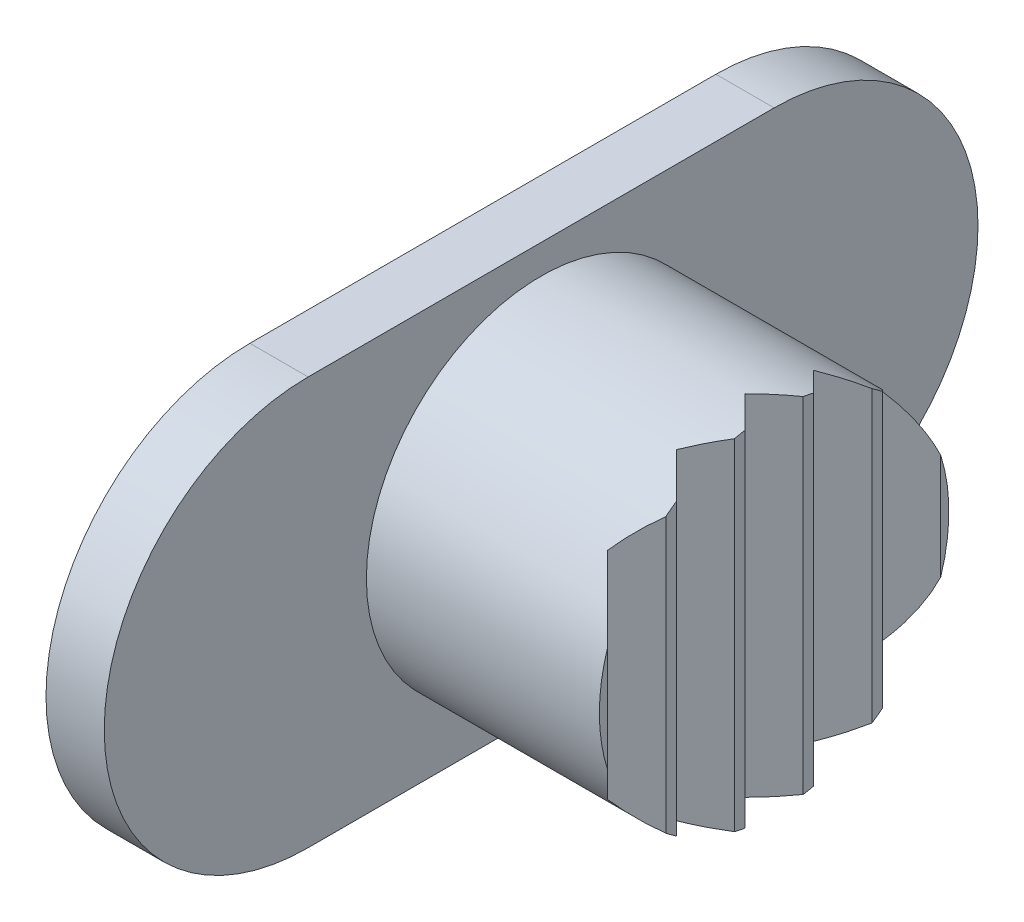
ISO-10303-21;
HEADER;
FILE_DESCRIPTION(('STEP AP214'),'2;1');
FILE_NAME('part.step','',(''),(''),'','','');
FILE_SCHEMA(('AUTOMOTIVE_DESIGN { 1 0 10303 214 1 1 1 1 }'));
ENDSEC;
DATA;
#1=APPLICATION_CONTEXT('core data for automotive mechanical design processes');
#2=APPLICATION_PROTOCOL_DEFINITION('international standard','automotive_design',2000,#1);
#3=PRODUCT_CONTEXT('',#1,'mechanical');
#4=PRODUCT('Part','Part','',(#3));
#5=PRODUCT_RELATED_PRODUCT_CATEGORY('part','',(#4));
#6=PRODUCT_DEFINITION_FORMATION('','',#4);
#7=PRODUCT_DEFINITION_CONTEXT('part definition',#1,'design');
#8=PRODUCT_DEFINITION('design','',#6,#7);
#9=PRODUCT_DEFINITION_SHAPE('','',#8);
#10=(LENGTH_UNIT() NAMED_UNIT(*) SI_UNIT(.MILLI.,.METRE.));
#11=(NAMED_UNIT(*) PLANE_ANGLE_UNIT() SI_UNIT($,.RADIAN.));
#12=(NAMED_UNIT(*) SI_UNIT($,.STERADIAN.) SOLID_ANGLE_UNIT());
#13=UNCERTAINTY_MEASURE_WITH_UNIT(LENGTH_MEASURE(1.E-05),#10,'distance_accuracy_value','');
#14=(GEOMETRIC_REPRESENTATION_CONTEXT(3) GLOBAL_UNCERTAINTY_ASSIGNED_CONTEXT((#13)) GLOBAL_UNIT_ASSIGNED_CONTEXT((#10,
#11,#12)) REPRESENTATION_CONTEXT('',''));
#15=CARTESIAN_POINT('',(0.,0.,0.));
#16=DIRECTION('',(0.,0.,1.));
#17=DIRECTION('',(1.,0.,0.));
#18=AXIS2_PLACEMENT_3D('',#15,#16,#17);
#19=CARTESIAN_POINT('',(5.,0.,0.));
#20=DIRECTION('',(1.,0.,0.));
#21=DIRECTION('',(0.,0.,-1.));
#22=AXIS2_PLACEMENT_3D('',#19,#20,#21);
#23=PLANE('',#22);
#24=DIRECTION('',(0.,-1.,0.));
#25=VECTOR('',#24,1.);
#26=CARTESIAN_POINT('',(5.,0.,-1.86));
#27=LINE('',#26,#25);
#28=CARTESIAN_POINT('',(4.99999999999997,2.35380542951197,-1.86000000000003));
#29=VERTEX_POINT('',#28);
#30=CARTESIAN_POINT('',(4.99999999999997,-2.35380542951197,-1.86000000000003));
#31=VERTEX_POINT('',#30);
#32=EDGE_CURVE('E11',#29,#31,#27,.T.);
#33=ORIENTED_EDGE('',*,*,#32,.F.);
#34=CARTESIAN_POINT('',(5.,0.,0.));
#35=DIRECTION('',(1.,0.,0.));
#36=DIRECTION('',(0.,0.,-1.));
#37=AXIS2_PLACEMENT_3D('',#34,#35,#36);
#38=CIRCLE('',#37,3.);
#39=CARTESIAN_POINT('',(4.99999999999995,2.48547782126492,-1.68000000000001));
#40=VERTEX_POINT('',#39);
#41=EDGE_CURVE('E276',#29,#40,#38,.T.);
#42=ORIENTED_EDGE('',*,*,#41,.T.);
#43=DIRECTION('',(0.,1.,0.));
#44=VECTOR('',#43,1.);
#45=CARTESIAN_POINT('',(5.,0.,-1.68000000000006));
#46=LINE('',#45,#44);
#47=CARTESIAN_POINT('',(5.,-2.48547782126492,-1.68000000000006));
#48=VERTEX_POINT('',#47);
#49=EDGE_CURVE('E386',#48,#40,#46,.T.);
#50=ORIENTED_EDGE('',*,*,#49,.F.);
#51=EDGE_CURVE('E275',#48,#31,#38,.T.);
#52=ORIENTED_EDGE('',*,*,#51,.T.);
#53=EDGE_LOOP('',(#33,#42,#50,#52));
#54=FACE_BOUND('',#53,.T.);
#55=ADVANCED_FACE('F39',(#54),#23,.T.);
#56=DIRECTION('',(0.,-1.,0.));
#57=VECTOR('',#56,1.);
#58=CARTESIAN_POINT('',(5.,0.,-0.680000000000011));
#59=LINE('',#58,#57);
#60=CARTESIAN_POINT('',(4.99999999999998,2.92191717883994,-0.680000000000027));
#61=VERTEX_POINT('',#60);
#62=CARTESIAN_POINT('',(4.99999999999998,-2.92191717883995,-0.680000000000027));
#63=VERTEX_POINT('',#62);
#64=EDGE_CURVE('E389',#61,#63,#59,.T.);
#65=ORIENTED_EDGE('',*,*,#64,.F.);
#66=CARTESIAN_POINT('',(4.99999999999999,2.9580398915498,-0.500000000000027));
#67=VERTEX_POINT('',#66);
#68=EDGE_CURVE('E473',#61,#67,#38,.T.);
#69=ORIENTED_EDGE('',*,*,#68,.T.);
#70=DIRECTION('',(0.,1.,0.));
#71=VECTOR('',#70,1.);
#72=CARTESIAN_POINT('',(5.,0.,-0.500000000000042));
#73=LINE('',#72,#71);
#74=CARTESIAN_POINT('',(5.,-2.9580398915498,-0.500000000000042));
#75=VERTEX_POINT('',#74);
#76=EDGE_CURVE('E380',#75,#67,#73,.T.);
#77=ORIENTED_EDGE('',*,*,#76,.F.);
#78=EDGE_CURVE('E436',#75,#63,#38,.T.);
#79=ORIENTED_EDGE('',*,*,#78,.T.);
#80=EDGE_LOOP('',(#65,#69,#77,#79));
#81=FACE_BOUND('',#80,.T.);
#82=ADVANCED_FACE('F412',(#81),#23,.T.);
#83=DIRECTION('',(0.,-1.,0.));
#84=VECTOR('',#83,1.);
#85=CARTESIAN_POINT('',(5.,0.,0.499999999999988));
#86=LINE('',#85,#84);
#87=CARTESIAN_POINT('',(4.99999999999995,2.95803989154981,0.499999999999942));
#88=VERTEX_POINT('',#87);
#89=CARTESIAN_POINT('',(4.99999999999995,-2.95803989154981,0.499999999999942));
#90=VERTEX_POINT('',#89);
#91=EDGE_CURVE('E383',#88,#90,#86,.T.);
#92=ORIENTED_EDGE('',*,*,#91,.F.);
#93=CARTESIAN_POINT('',(4.99999999999998,2.92191717883995,0.679999999999994));
#94=VERTEX_POINT('',#93);
#95=EDGE_CURVE('E431',#88,#94,#38,.T.);
#96=ORIENTED_EDGE('',*,*,#95,.T.);
#97=DIRECTION('',(0.,1.,0.));
#98=VECTOR('',#97,1.);
#99=CARTESIAN_POINT('',(5.,0.,0.67999999999997));
#100=LINE('',#99,#98);
#101=CARTESIAN_POINT('',(5.,-2.92191717883996,0.67999999999997));
#102=VERTEX_POINT('',#101);
#103=EDGE_CURVE('E374',#102,#94,#100,.T.);
#104=ORIENTED_EDGE('',*,*,#103,.F.);
#105=EDGE_CURVE('E432',#102,#90,#38,.T.);
#106=ORIENTED_EDGE('',*,*,#105,.T.);
#107=EDGE_LOOP('',(#92,#96,#104,#106));
#108=FACE_BOUND('',#107,.T.);
#109=ADVANCED_FACE('F423',(#108),#23,.T.);
#110=DIRECTION('',(0.,-1.,0.));
#111=VECTOR('',#110,1.);
#112=CARTESIAN_POINT('',(5.,0.,1.68000000000001));
#113=LINE('',#112,#111);
#114=CARTESIAN_POINT('',(4.99999999999999,2.48547782126495,1.67999999999999));
#115=VERTEX_POINT('',#114);
#116=CARTESIAN_POINT('',(4.99999999999999,-2.48547782126495,1.67999999999999));
#117=VERTEX_POINT('',#116);
#118=EDGE_CURVE('E377',#115,#117,#113,.T.);
#119=ORIENTED_EDGE('',*,*,#118,.F.);
#120=CARTESIAN_POINT('',(4.99999999999999,2.35380542951198,1.85999999999999));
#121=VERTEX_POINT('',#120);
#122=EDGE_CURVE('E427',#115,#121,#38,.T.);
#123=ORIENTED_EDGE('',*,*,#122,.T.);
#124=DIRECTION('',(0.,1.,0.));
#125=VECTOR('',#124,1.);
#126=CARTESIAN_POINT('',(5.,0.,1.85999999999998));
#127=LINE('',#126,#125);
#128=CARTESIAN_POINT('',(5.,-2.35380542951198,1.85999999999998));
#129=VERTEX_POINT('',#128);
#130=EDGE_CURVE('E326',#129,#121,#127,.T.);
#131=ORIENTED_EDGE('',*,*,#130,.F.);
#132=EDGE_CURVE('E224',#129,#117,#38,.T.);
#133=ORIENTED_EDGE('',*,*,#132,.T.);
#134=EDGE_LOOP('',(#119,#123,#131,#133));
#135=FACE_BOUND('',#134,.T.);
#136=ADVANCED_FACE('F415',(#135),#23,.T.);
#137=DIRECTION('',(0.,-1.,0.));
#138=VECTOR('',#137,1.);
#139=CARTESIAN_POINT('',(5.,0.,2.86));
#140=LINE('',#139,#138);
#141=CARTESIAN_POINT('',(5.,0.905759349937949,2.86));
#142=VERTEX_POINT('',#141);
#143=CARTESIAN_POINT('',(5.,-0.905759349937951,2.86));
#144=VERTEX_POINT('',#143);
#145=EDGE_CURVE('E202',#142,#144,#140,.T.);
#146=ORIENTED_EDGE('',*,*,#145,.F.);
#147=EDGE_CURVE('E425',#142,#144,#38,.T.);
#148=ORIENTED_EDGE('',*,*,#147,.T.);
#149=EDGE_LOOP('',(#146,#148));
#150=FACE_BOUND('',#149,.T.);
#151=ADVANCED_FACE('F401',(#150),#23,.T.);
#152=CARTESIAN_POINT('',(4.,0.,0.));
#153=DIRECTION('',(-1.,0.,0.));
#154=DIRECTION('',(0.,0.,1.));
#155=AXIS2_PLACEMENT_3D('',#152,#153,#154);
#156=CYLINDRICAL_SURFACE('',#155,3.);
#157=CARTESIAN_POINT('',(1.,0.,0.));
#158=DIRECTION('',(-1.,0.,0.));
#159=DIRECTION('',(0.,0.,1.));
#160=AXIS2_PLACEMENT_3D('',#157,#158,#159);
#161=CIRCLE('',#160,3.);
#162=CARTESIAN_POINT('',(1.,0.,3.));
#163=VERTEX_POINT('',#162);
#164=EDGE_CURVE('E322',#163,#163,#161,.T.);
#165=ORIENTED_EDGE('',*,*,#164,.F.);
#166=EDGE_LOOP('',(#165));
#167=FACE_BOUND('',#166,.T.);
#168=ORIENTED_EDGE('',*,*,#41,.F.);
#169=CARTESIAN_POINT('',(6.86000000000003,0.,0.));
#170=DIRECTION('',(-0.707106781186541,0.,0.707106781186554));
#171=DIRECTION('',(-0.707106781186554,0.,-0.707106781186541));
#172=AXIS2_PLACEMENT_3D('',#169,#170,#171);
#173=ELLIPSE('',#172,4.24264068711933,3.);
#174=CARTESIAN_POINT('',(4.49999999999997,1.85213390444641,-2.36000000000002));
#175=VERTEX_POINT('',#174);
#176=EDGE_CURVE('E266',#29,#175,#173,.T.);
#177=ORIENTED_EDGE('',*,*,#176,.T.);
#178=CARTESIAN_POINT('',(2.14,0.,0.));
#179=DIRECTION('',(-0.707106781186555,0.,-0.70710678118654));
#180=DIRECTION('',(-0.70710678118654,0.,0.707106781186555));
#181=AXIS2_PLACEMENT_3D('',#178,#179,#180);
#182=ELLIPSE('',#181,4.24264068711924,3.);
#183=CARTESIAN_POINT('',(4.99999999999996,0.905759349937729,-2.86000000000003));
#184=VERTEX_POINT('',#183);
#185=EDGE_CURVE('E265',#175,#184,#182,.T.);
#186=ORIENTED_EDGE('',*,*,#185,.T.);
#187=CARTESIAN_POINT('',(5.,-0.90575934993773,-2.86000000000007));
#188=VERTEX_POINT('',#187);
#189=EDGE_CURVE('E271',#188,#184,#38,.T.);
#190=ORIENTED_EDGE('',*,*,#189,.F.);
#191=CARTESIAN_POINT('',(4.49999999999997,-1.85213390444641,-2.36000000000002));
#192=VERTEX_POINT('',#191);
#193=EDGE_CURVE('E55',#188,#192,#182,.T.);
#194=ORIENTED_EDGE('',*,*,#193,.T.);
#195=EDGE_CURVE('E270',#192,#31,#173,.T.);
#196=ORIENTED_EDGE('',*,*,#195,.T.);
#197=ORIENTED_EDGE('',*,*,#51,.F.);
#198=CARTESIAN_POINT('',(3.31999999999998,0.,0.));
#199=DIRECTION('',(-0.707106781186555,0.,-0.70710678118654));
#200=DIRECTION('',(-0.70710678118654,0.,0.707106781186555));
#201=AXIS2_PLACEMENT_3D('',#198,#199,#200);
#202=ELLIPSE('',#201,4.24264068711924,3.);
#203=CARTESIAN_POINT('',(4.49999999999996,-2.75818781086423,-1.18));
#204=VERTEX_POINT('',#203);
#205=EDGE_CURVE('E63',#48,#204,#202,.T.);
#206=ORIENTED_EDGE('',*,*,#205,.T.);
#207=CARTESIAN_POINT('',(5.68000000000008,0.,0.));
#208=DIRECTION('',(-0.707106781186509,0.,0.707106781186585));
#209=DIRECTION('',(-0.707106781186586,0.,-0.70710678118651));
#210=AXIS2_PLACEMENT_3D('',#207,#208,#209);
#211=ELLIPSE('',#210,4.24264068711951,3.);
#212=EDGE_CURVE('E262',#204,#63,#211,.T.);
#213=ORIENTED_EDGE('',*,*,#212,.T.);
#214=ORIENTED_EDGE('',*,*,#78,.F.);
#215=CARTESIAN_POINT('',(4.49999999999999,0.,0.));
#216=DIRECTION('',(-0.70710678118657,0.,-0.707106781186525));
#217=DIRECTION('',(-0.707106781186525,0.,0.70710678118657));
#218=AXIS2_PLACEMENT_3D('',#215,#216,#217);
#219=ELLIPSE('',#218,4.24264068711915,3.);
#220=CARTESIAN_POINT('',(4.49999999999999,-3.,0.));
#221=VERTEX_POINT('',#220);
#222=EDGE_CURVE('E245',#75,#221,#219,.T.);
#223=ORIENTED_EDGE('',*,*,#222,.T.);
#224=CARTESIAN_POINT('',(4.49999999999999,0.,0.));
#225=DIRECTION('',(-0.707106781186532,0.,0.707106781186563));
#226=DIRECTION('',(-0.707106781186563,0.,-0.707106781186532));
#227=AXIS2_PLACEMENT_3D('',#224,#225,#226);
#228=ELLIPSE('',#227,4.24264068711938,3.);
#229=EDGE_CURVE('E254',#221,#90,#228,.T.);
#230=ORIENTED_EDGE('',*,*,#229,.T.);
#231=ORIENTED_EDGE('',*,*,#105,.F.);
#232=CARTESIAN_POINT('',(5.67999999999996,0.,0.));
#233=DIRECTION('',(-0.707106781186555,0.,-0.70710678118654));
#234=DIRECTION('',(-0.70710678118654,0.,0.707106781186555));
#235=AXIS2_PLACEMENT_3D('',#232,#233,#234);
#236=ELLIPSE('',#235,4.24264068711924,3.);
#237=CARTESIAN_POINT('',(4.49999999999998,-2.75818781086423,1.18));
#238=VERTEX_POINT('',#237);
#239=EDGE_CURVE('E208',#102,#238,#236,.T.);
#240=ORIENTED_EDGE('',*,*,#239,.T.);
#241=CARTESIAN_POINT('',(3.31999999999996,0.,0.));
#242=DIRECTION('',(-0.707106781186541,0.,0.707106781186554));
#243=DIRECTION('',(-0.707106781186554,0.,-0.707106781186541));
#244=AXIS2_PLACEMENT_3D('',#241,#242,#243);
#245=ELLIPSE('',#244,4.24264068711933,3.);
#246=EDGE_CURVE('E244',#238,#117,#245,.T.);
#247=ORIENTED_EDGE('',*,*,#246,.T.);
#248=ORIENTED_EDGE('',*,*,#132,.F.);
#249=CARTESIAN_POINT('',(6.85999999999994,0.,0.));
#250=DIRECTION('',(-0.707106781186555,0.,-0.70710678118654));
#251=DIRECTION('',(-0.70710678118654,0.,0.707106781186555));
#252=AXIS2_PLACEMENT_3D('',#249,#250,#251);
#253=ELLIPSE('',#252,4.24264068711924,3.);
#254=CARTESIAN_POINT('',(4.49999999999999,-1.85213390444644,2.36));
#255=VERTEX_POINT('',#254);
#256=EDGE_CURVE('E213',#129,#255,#253,.T.);
#257=ORIENTED_EDGE('',*,*,#256,.T.);
#258=CARTESIAN_POINT('',(2.13999999999995,0.,0.));
#259=DIRECTION('',(-0.707106781186541,0.,0.707106781186554));
#260=DIRECTION('',(-0.707106781186554,0.,-0.707106781186541));
#261=AXIS2_PLACEMENT_3D('',#258,#259,#260);
#262=ELLIPSE('',#261,4.24264068711933,3.);
#263=EDGE_CURVE('E196',#255,#144,#262,.T.);
#264=ORIENTED_EDGE('',*,*,#263,.T.);
#265=ORIENTED_EDGE('',*,*,#147,.F.);
#266=CARTESIAN_POINT('',(4.49999999999999,1.85213390444644,2.36));
#267=VERTEX_POINT('',#266);
#268=EDGE_CURVE('E209',#142,#267,#262,.T.);
#269=ORIENTED_EDGE('',*,*,#268,.T.);
#270=EDGE_CURVE('E216',#267,#121,#253,.T.);
#271=ORIENTED_EDGE('',*,*,#270,.T.);
#272=ORIENTED_EDGE('',*,*,#122,.F.);
#273=CARTESIAN_POINT('',(4.49999999999998,2.75818781086423,1.18));
#274=VERTEX_POINT('',#273);
#275=EDGE_CURVE('E240',#115,#274,#245,.T.);
#276=ORIENTED_EDGE('',*,*,#275,.T.);
#277=EDGE_CURVE('E239',#274,#94,#236,.T.);
#278=ORIENTED_EDGE('',*,*,#277,.T.);
#279=ORIENTED_EDGE('',*,*,#95,.F.);
#280=CARTESIAN_POINT('',(4.49999999999999,3.,0.));
#281=VERTEX_POINT('',#280);
#282=EDGE_CURVE('E250',#88,#281,#228,.T.);
#283=ORIENTED_EDGE('',*,*,#282,.T.);
#284=EDGE_CURVE('E249',#281,#67,#219,.T.);
#285=ORIENTED_EDGE('',*,*,#284,.T.);
#286=ORIENTED_EDGE('',*,*,#68,.F.);
#287=CARTESIAN_POINT('',(4.49999999999996,2.75818781086423,-1.18));
#288=VERTEX_POINT('',#287);
#289=EDGE_CURVE('E258',#61,#288,#211,.T.);
#290=ORIENTED_EDGE('',*,*,#289,.T.);
#291=EDGE_CURVE('E257',#288,#40,#202,.T.);
#292=ORIENTED_EDGE('',*,*,#291,.T.);
#293=EDGE_LOOP('',(#168,#177,#186,#190,#194,#196,#197,#206,#213,#214,#223,#230,#231,#240,#247,
#248,#257,#264,#265,#269,#271,#272,#276,#278,#279,#283,#285,#286,#290,#292));
#294=FACE_BOUND('',#293,.T.);
#295=ADVANCED_FACE('F41',(#167,#294),#156,.T.);
#296=CARTESIAN_POINT('',(0.,0.,0.));
#297=DIRECTION('',(1.,0.,0.));
#298=DIRECTION('',(0.,0.,-1.));
#299=AXIS2_PLACEMENT_3D('',#296,#297,#298);
#300=PLANE('',#299);
#301=DIRECTION('',(0.,1.,0.));
#302=VECTOR('',#301,1.);
#303=CARTESIAN_POINT('',(0.,-1.8,-1.8));
#304=LINE('',#303,#302);
#305=CARTESIAN_POINT('',(0.,-1.8,-1.8));
#306=VERTEX_POINT('',#305);
#307=CARTESIAN_POINT('',(0.,1.8,-1.8));
#308=VERTEX_POINT('',#307);
#309=EDGE_CURVE('E313',#306,#308,#304,.T.);
#310=ORIENTED_EDGE('',*,*,#309,.T.);
#311=DIRECTION('',(0.,0.,1.));
#312=VECTOR('',#311,1.);
#313=CARTESIAN_POINT('',(0.,1.8,1.8));
#314=LINE('',#313,#312);
#315=CARTESIAN_POINT('',(0.,1.8,1.8));
#316=VERTEX_POINT('',#315);
#317=EDGE_CURVE('E349',#308,#316,#314,.T.);
#318=ORIENTED_EDGE('',*,*,#317,.T.);
#319=DIRECTION('',(0.,-1.,0.));
#320=VECTOR('',#319,1.);
#321=CARTESIAN_POINT('',(0.,-1.8,1.8));
#322=LINE('',#321,#320);
#323=CARTESIAN_POINT('',(0.,-1.8,1.8));
#324=VERTEX_POINT('',#323);
#325=EDGE_CURVE('E353',#316,#324,#322,.T.);
#326=ORIENTED_EDGE('',*,*,#325,.T.);
#327=DIRECTION('',(0.,0.,-1.));
#328=VECTOR('',#327,1.);
#329=CARTESIAN_POINT('',(0.,-1.8,1.8));
#330=LINE('',#329,#328);
#331=EDGE_CURVE('E333',#324,#306,#330,.T.);
#332=ORIENTED_EDGE('',*,*,#331,.T.);
#333=EDGE_LOOP('',(#310,#318,#326,#332));
#334=FACE_BOUND('',#333,.T.);
#335=CARTESIAN_POINT('',(0.,0.,-4.));
#336=DIRECTION('',(-1.,0.,0.));
#337=DIRECTION('',(0.,0.,1.));
#338=AXIS2_PLACEMENT_3D('',#335,#336,#337);
#339=CIRCLE('',#338,3.5);
#340=CARTESIAN_POINT('',(0.,3.5,-4.));
#341=VERTEX_POINT('',#340);
#342=CARTESIAN_POINT('',(0.,-3.5,-4.));
#343=VERTEX_POINT('',#342);
#344=EDGE_CURVE('E295',#341,#343,#339,.T.);
#345=ORIENTED_EDGE('',*,*,#344,.T.);
#346=DIRECTION('',(0.,0.,1.));
#347=VECTOR('',#346,1.);
#348=CARTESIAN_POINT('',(0.,-3.5,-4.));
#349=LINE('',#348,#347);
#350=CARTESIAN_POINT('',(0.,-3.5,4.));
#351=VERTEX_POINT('',#350);
#352=EDGE_CURVE('E299',#343,#351,#349,.T.);
#353=ORIENTED_EDGE('',*,*,#352,.T.);
#354=CARTESIAN_POINT('',(0.,0.,4.));
#355=DIRECTION('',(-1.,0.,0.));
#356=DIRECTION('',(0.,0.,1.));
#357=AXIS2_PLACEMENT_3D('',#354,#355,#356);
#358=CIRCLE('',#357,3.5);
#359=CARTESIAN_POINT('',(0.,3.5,4.));
#360=VERTEX_POINT('',#359);
#361=EDGE_CURVE('E303',#351,#360,#358,.T.);
#362=ORIENTED_EDGE('',*,*,#361,.T.);
#363=DIRECTION('',(0.,0.,-1.));
#364=VECTOR('',#363,1.);
#365=CARTESIAN_POINT('',(0.,3.5,-4.));
#366=LINE('',#365,#364);
#367=EDGE_CURVE('E282',#360,#341,#366,.T.);
#368=ORIENTED_EDGE('',*,*,#367,.T.);
#369=EDGE_LOOP('',(#345,#353,#362,#368));
#370=FACE_BOUND('',#369,.T.);
#371=ADVANCED_FACE('F421',(#334,#370),#300,.F.);
#372=CARTESIAN_POINT('',(4.,-1.8,-1.8));
#373=DIRECTION('',(0.,0.,1.));
#374=DIRECTION('',(1.,0.,0.));
#375=AXIS2_PLACEMENT_3D('',#372,#373,#374);
#376=PLANE('',#375);
#377=ORIENTED_EDGE('',*,*,#309,.F.);
#378=DIRECTION('',(-1.,0.,0.));
#379=VECTOR('',#378,1.);
#380=CARTESIAN_POINT('',(4.,-1.8,-1.8));
#381=LINE('',#380,#379);
#382=CARTESIAN_POINT('',(4.,-1.8,-1.8));
#383=VERTEX_POINT('',#382);
#384=EDGE_CURVE('E345',#383,#306,#381,.T.);
#385=ORIENTED_EDGE('',*,*,#384,.F.);
#386=DIRECTION('',(0.,1.,0.));
#387=VECTOR('',#386,1.);
#388=CARTESIAN_POINT('',(4.,-1.8,-1.8));
#389=LINE('',#388,#387);
#390=CARTESIAN_POINT('',(4.,1.8,-1.8));
#391=VERTEX_POINT('',#390);
#392=EDGE_CURVE('E328',#383,#391,#389,.T.);
#393=ORIENTED_EDGE('',*,*,#392,.T.);
#394=DIRECTION('',(-1.,0.,0.));
#395=VECTOR('',#394,1.);
#396=CARTESIAN_POINT('',(4.,1.8,-1.8));
#397=LINE('',#396,#395);
#398=EDGE_CURVE('E327',#391,#308,#397,.T.);
#399=ORIENTED_EDGE('',*,*,#398,.T.);
#400=EDGE_LOOP('',(#377,#385,#393,#399));
#401=FACE_BOUND('',#400,.T.);
#402=ADVANCED_FACE('F653',(#401),#376,.T.);
#403=CARTESIAN_POINT('',(4.,1.8,1.8));
#404=DIRECTION('',(0.,-1.,0.));
#405=DIRECTION('',(0.,0.,-1.));
#406=AXIS2_PLACEMENT_3D('',#403,#404,#405);
#407=PLANE('',#406);
#408=ORIENTED_EDGE('',*,*,#317,.F.);
#409=ORIENTED_EDGE('',*,*,#398,.F.);
#410=DIRECTION('',(0.,0.,1.));
#411=VECTOR('',#410,1.);
#412=CARTESIAN_POINT('',(4.,1.8,1.8));
#413=LINE('',#412,#411);
#414=CARTESIAN_POINT('',(4.,1.8,1.8));
#415=VERTEX_POINT('',#414);
#416=EDGE_CURVE('E332',#391,#415,#413,.T.);
#417=ORIENTED_EDGE('',*,*,#416,.T.);
#418=DIRECTION('',(-1.,0.,0.));
#419=VECTOR('',#418,1.);
#420=CARTESIAN_POINT('',(4.,1.8,1.8));
#421=LINE('',#420,#419);
#422=EDGE_CURVE('E365',#415,#316,#421,.T.);
#423=ORIENTED_EDGE('',*,*,#422,.T.);
#424=EDGE_LOOP('',(#408,#409,#417,#423));
#425=FACE_BOUND('',#424,.T.);
#426=ADVANCED_FACE('F643',(#425),#407,.T.);
#427=CARTESIAN_POINT('',(4.,-1.8,1.8));
#428=DIRECTION('',(0.,0.,-1.));
#429=DIRECTION('',(-1.,0.,0.));
#430=AXIS2_PLACEMENT_3D('',#427,#428,#429);
#431=PLANE('',#430);
#432=ORIENTED_EDGE('',*,*,#325,.F.);
#433=ORIENTED_EDGE('',*,*,#422,.F.);
#434=DIRECTION('',(0.,-1.,0.));
#435=VECTOR('',#434,1.);
#436=CARTESIAN_POINT('',(4.,-1.8,1.8));
#437=LINE('',#436,#435);
#438=CARTESIAN_POINT('',(4.,-1.8,1.8));
#439=VERTEX_POINT('',#438);
#440=EDGE_CURVE('E337',#415,#439,#437,.T.);
#441=ORIENTED_EDGE('',*,*,#440,.T.);
#442=DIRECTION('',(-1.,0.,0.));
#443=VECTOR('',#442,1.);
#444=CARTESIAN_POINT('',(4.,-1.8,1.8));
#445=LINE('',#444,#443);
#446=EDGE_CURVE('E362',#439,#324,#445,.T.);
#447=ORIENTED_EDGE('',*,*,#446,.T.);
#448=EDGE_LOOP('',(#432,#433,#441,#447));
#449=FACE_BOUND('',#448,.T.);
#450=ADVANCED_FACE('F632',(#449),#431,.T.);
#451=CARTESIAN_POINT('',(4.,-1.8,1.8));
#452=DIRECTION('',(0.,1.,0.));
#453=DIRECTION('',(0.,0.,1.));
#454=AXIS2_PLACEMENT_3D('',#451,#452,#453);
#455=PLANE('',#454);
#456=ORIENTED_EDGE('',*,*,#331,.F.);
#457=ORIENTED_EDGE('',*,*,#446,.F.);
#458=DIRECTION('',(0.,0.,-1.));
#459=VECTOR('',#458,1.);
#460=CARTESIAN_POINT('',(4.,-1.8,1.8));
#461=LINE('',#460,#459);
#462=EDGE_CURVE('E341',#439,#383,#461,.T.);
#463=ORIENTED_EDGE('',*,*,#462,.T.);
#464=ORIENTED_EDGE('',*,*,#384,.T.);
#465=EDGE_LOOP('',(#456,#457,#463,#464));
#466=FACE_BOUND('',#465,.T.);
#467=ADVANCED_FACE('F626',(#466),#455,.T.);
#468=CARTESIAN_POINT('',(1.,0.,-4.));
#469=DIRECTION('',(-1.,0.,0.));
#470=DIRECTION('',(0.,0.,1.));
#471=AXIS2_PLACEMENT_3D('',#468,#469,#470);
#472=PLANE('',#471);
#473=CARTESIAN_POINT('',(1.,0.,-4.));
#474=DIRECTION('',(-1.,0.,0.));
#475=DIRECTION('',(0.,0.,1.));
#476=AXIS2_PLACEMENT_3D('',#473,#474,#475);
#477=CIRCLE('',#476,3.5);
#478=CARTESIAN_POINT('',(1.,3.5,-4.));
#479=VERTEX_POINT('',#478);
#480=CARTESIAN_POINT('',(1.,-3.5,-4.));
#481=VERTEX_POINT('',#480);
#482=EDGE_CURVE('E277',#479,#481,#477,.T.);
#483=ORIENTED_EDGE('',*,*,#482,.F.);
#484=DIRECTION('',(0.,0.,-1.));
#485=VECTOR('',#484,1.);
#486=CARTESIAN_POINT('',(1.,3.5,-4.));
#487=LINE('',#486,#485);
#488=CARTESIAN_POINT('',(1.,3.5,4.));
#489=VERTEX_POINT('',#488);
#490=EDGE_CURVE('E290',#489,#479,#487,.T.);
#491=ORIENTED_EDGE('',*,*,#490,.F.);
#492=CARTESIAN_POINT('',(1.,0.,4.));
#493=DIRECTION('',(-1.,0.,0.));
#494=DIRECTION('',(0.,0.,1.));
#495=AXIS2_PLACEMENT_3D('',#492,#493,#494);
#496=CIRCLE('',#495,3.5);
#497=CARTESIAN_POINT('',(1.,-3.5,4.));
#498=VERTEX_POINT('',#497);
#499=EDGE_CURVE('E286',#498,#489,#496,.T.);
#500=ORIENTED_EDGE('',*,*,#499,.F.);
#501=DIRECTION('',(0.,0.,1.));
#502=VECTOR('',#501,1.);
#503=CARTESIAN_POINT('',(1.,-3.5,-4.));
#504=LINE('',#503,#502);
#505=EDGE_CURVE('E281',#481,#498,#504,.T.);
#506=ORIENTED_EDGE('',*,*,#505,.F.);
#507=EDGE_LOOP('',(#483,#491,#500,#506));
#508=FACE_BOUND('',#507,.T.);
#509=ORIENTED_EDGE('',*,*,#164,.T.);
#510=EDGE_LOOP('',(#509));
#511=FACE_BOUND('',#510,.T.);
#512=ADVANCED_FACE('F631',(#508,#511),#472,.F.);
#513=CARTESIAN_POINT('',(1.,0.,-4.));
#514=DIRECTION('',(-1.,0.,0.));
#515=DIRECTION('',(0.,0.,1.));
#516=AXIS2_PLACEMENT_3D('',#513,#514,#515);
#517=CYLINDRICAL_SURFACE('',#516,3.5);
#518=ORIENTED_EDGE('',*,*,#344,.F.);
#519=DIRECTION('',(-1.,0.,0.));
#520=VECTOR('',#519,1.);
#521=CARTESIAN_POINT('',(1.,3.5,-4.));
#522=LINE('',#521,#520);
#523=EDGE_CURVE('E310',#479,#341,#522,.T.);
#524=ORIENTED_EDGE('',*,*,#523,.F.);
#525=ORIENTED_EDGE('',*,*,#482,.T.);
#526=DIRECTION('',(-1.,0.,0.));
#527=VECTOR('',#526,1.);
#528=CARTESIAN_POINT('',(1.,-3.5,-4.));
#529=LINE('',#528,#527);
#530=EDGE_CURVE('E294',#481,#343,#529,.T.);
#531=ORIENTED_EDGE('',*,*,#530,.T.);
#532=EDGE_LOOP('',(#518,#524,#525,#531));
#533=FACE_BOUND('',#532,.T.);
#534=ADVANCED_FACE('F691',(#533),#517,.T.);
#535=CARTESIAN_POINT('',(1.,3.5,-4.));
#536=DIRECTION('',(0.,1.,0.));
#537=DIRECTION('',(0.,0.,1.));
#538=AXIS2_PLACEMENT_3D('',#535,#536,#537);
#539=PLANE('',#538);
#540=ORIENTED_EDGE('',*,*,#367,.F.);
#541=DIRECTION('',(-1.,0.,0.));
#542=VECTOR('',#541,1.);
#543=CARTESIAN_POINT('',(1.,3.5,4.));
#544=LINE('',#543,#542);
#545=EDGE_CURVE('E314',#489,#360,#544,.T.);
#546=ORIENTED_EDGE('',*,*,#545,.F.);
#547=ORIENTED_EDGE('',*,*,#490,.T.);
#548=ORIENTED_EDGE('',*,*,#523,.T.);
#549=EDGE_LOOP('',(#540,#546,#547,#548));
#550=FACE_BOUND('',#549,.T.);
#551=ADVANCED_FACE('F681',(#550),#539,.T.);
#552=CARTESIAN_POINT('',(1.,0.,4.));
#553=DIRECTION('',(-1.,0.,0.));
#554=DIRECTION('',(0.,0.,1.));
#555=AXIS2_PLACEMENT_3D('',#552,#553,#554);
#556=CYLINDRICAL_SURFACE('',#555,3.5);
#557=ORIENTED_EDGE('',*,*,#361,.F.);
#558=DIRECTION('',(-1.,0.,0.));
#559=VECTOR('',#558,1.);
#560=CARTESIAN_POINT('',(1.,-3.5,4.));
#561=LINE('',#560,#559);
#562=EDGE_CURVE('E317',#498,#351,#561,.T.);
#563=ORIENTED_EDGE('',*,*,#562,.F.);
#564=ORIENTED_EDGE('',*,*,#499,.T.);
#565=ORIENTED_EDGE('',*,*,#545,.T.);
#566=EDGE_LOOP('',(#557,#563,#564,#565));
#567=FACE_BOUND('',#566,.T.);
#568=ADVANCED_FACE('F671',(#567),#556,.T.);
#569=CARTESIAN_POINT('',(1.,-3.5,-4.));
#570=DIRECTION('',(0.,-1.,0.));
#571=DIRECTION('',(0.,0.,-1.));
#572=AXIS2_PLACEMENT_3D('',#569,#570,#571);
#573=PLANE('',#572);
#574=ORIENTED_EDGE('',*,*,#352,.F.);
#575=ORIENTED_EDGE('',*,*,#530,.F.);
#576=ORIENTED_EDGE('',*,*,#505,.T.);
#577=ORIENTED_EDGE('',*,*,#562,.T.);
#578=EDGE_LOOP('',(#574,#575,#576,#577));
#579=FACE_BOUND('',#578,.T.);
#580=ADVANCED_FACE('F407',(#579),#573,.T.);
#581=CARTESIAN_POINT('',(4.,0.,0.));
#582=DIRECTION('',(1.,0.,0.));
#583=DIRECTION('',(0.,0.,-1.));
#584=AXIS2_PLACEMENT_3D('',#581,#582,#583);
#585=PLANE('',#584);
#586=ORIENTED_EDGE('',*,*,#416,.F.);
#587=ORIENTED_EDGE('',*,*,#392,.F.);
#588=ORIENTED_EDGE('',*,*,#462,.F.);
#589=ORIENTED_EDGE('',*,*,#440,.F.);
#590=EDGE_LOOP('',(#586,#587,#588,#589));
#591=FACE_BOUND('',#590,.T.);
#592=ADVANCED_FACE('F399',(#591),#585,.F.);
#593=DIRECTION('',(0.,1.,0.));
#594=VECTOR('',#593,1.);
#595=CARTESIAN_POINT('',(5.,0.,-2.86000000000007));
#596=LINE('',#595,#594);
#597=EDGE_CURVE('E48',#188,#184,#596,.T.);
#598=ORIENTED_EDGE('',*,*,#597,.F.);
#599=ORIENTED_EDGE('',*,*,#189,.T.);
#600=EDGE_LOOP('',(#598,#599));
#601=FACE_BOUND('',#600,.T.);
#602=ADVANCED_FACE('F397',(#601),#23,.T.);
#603=CARTESIAN_POINT('',(4.49999999999999,-3.5,2.36));
#604=DIRECTION('',(-0.707106781186541,0.,0.707106781186554));
#605=DIRECTION('',(0.707106781186554,0.,0.707106781186541));
#606=AXIS2_PLACEMENT_3D('',#603,#604,#605);
#607=PLANE('',#606);
#608=DIRECTION('',(0.,1.,0.));
#609=VECTOR('',#608,1.);
#610=CARTESIAN_POINT('',(4.49999999999999,-3.5,2.36));
#611=LINE('',#610,#609);
#612=EDGE_CURVE('E199',#255,#267,#611,.T.);
#613=ORIENTED_EDGE('',*,*,#612,.T.);
#614=ORIENTED_EDGE('',*,*,#268,.F.);
#615=ORIENTED_EDGE('',*,*,#145,.T.);
#616=ORIENTED_EDGE('',*,*,#263,.F.);
#617=EDGE_LOOP('',(#613,#614,#615,#616));
#618=FACE_BOUND('',#617,.T.);
#619=ADVANCED_FACE('F198',(#618),#607,.F.);
#620=CARTESIAN_POINT('',(4.99999999999999,-3.5,1.85999999999999));
#621=DIRECTION('',(-0.707106781186555,0.,-0.70710678118654));
#622=DIRECTION('',(-0.70710678118654,0.,0.707106781186555));
#623=AXIS2_PLACEMENT_3D('',#620,#621,#622);
#624=PLANE('',#623);
#625=ORIENTED_EDGE('',*,*,#612,.F.);
#626=ORIENTED_EDGE('',*,*,#256,.F.);
#627=ORIENTED_EDGE('',*,*,#130,.T.);
#628=ORIENTED_EDGE('',*,*,#270,.F.);
#629=EDGE_LOOP('',(#625,#626,#627,#628));
#630=FACE_BOUND('',#629,.T.);
#631=ADVANCED_FACE('F212',(#630),#624,.F.);
#632=CARTESIAN_POINT('',(4.49999999999998,-3.5,1.18));
#633=DIRECTION('',(-0.707106781186541,0.,0.707106781186554));
#634=DIRECTION('',(0.707106781186554,0.,0.707106781186541));
#635=AXIS2_PLACEMENT_3D('',#632,#633,#634);
#636=PLANE('',#635);
#637=DIRECTION('',(0.,1.,0.));
#638=VECTOR('',#637,1.);
#639=CARTESIAN_POINT('',(4.49999999999998,-3.5,1.18));
#640=LINE('',#639,#638);
#641=EDGE_CURVE('E218',#238,#274,#640,.T.);
#642=ORIENTED_EDGE('',*,*,#641,.T.);
#643=ORIENTED_EDGE('',*,*,#275,.F.);
#644=ORIENTED_EDGE('',*,*,#118,.T.);
#645=ORIENTED_EDGE('',*,*,#246,.F.);
#646=EDGE_LOOP('',(#642,#643,#644,#645));
#647=FACE_BOUND('',#646,.T.);
#648=ADVANCED_FACE('F490',(#647),#636,.F.);
#649=CARTESIAN_POINT('',(4.99999999999998,-3.5,0.679999999999994));
#650=DIRECTION('',(-0.707106781186555,0.,-0.70710678118654));
#651=DIRECTION('',(-0.70710678118654,0.,0.707106781186555));
#652=AXIS2_PLACEMENT_3D('',#649,#650,#651);
#653=PLANE('',#652);
#654=ORIENTED_EDGE('',*,*,#641,.F.);
#655=ORIENTED_EDGE('',*,*,#239,.F.);
#656=ORIENTED_EDGE('',*,*,#103,.T.);
#657=ORIENTED_EDGE('',*,*,#277,.F.);
#658=EDGE_LOOP('',(#654,#655,#656,#657));
#659=FACE_BOUND('',#658,.T.);
#660=ADVANCED_FACE('F491',(#659),#653,.F.);
#661=CARTESIAN_POINT('',(4.49999999999999,-3.5,0.));
#662=DIRECTION('',(-0.707106781186532,0.,0.707106781186563));
#663=DIRECTION('',(0.707106781186563,0.,0.707106781186532));
#664=AXIS2_PLACEMENT_3D('',#661,#662,#663);
#665=PLANE('',#664);
#666=DIRECTION('',(0.,1.,0.));
#667=VECTOR('',#666,1.);
#668=CARTESIAN_POINT('',(4.49999999999999,-3.5,0.));
#669=LINE('',#668,#667);
#670=EDGE_CURVE('E483',#221,#281,#669,.T.);
#671=ORIENTED_EDGE('',*,*,#670,.T.);
#672=ORIENTED_EDGE('',*,*,#282,.F.);
#673=ORIENTED_EDGE('',*,*,#91,.T.);
#674=ORIENTED_EDGE('',*,*,#229,.F.);
#675=EDGE_LOOP('',(#671,#672,#673,#674));
#676=FACE_BOUND('',#675,.T.);
#677=ADVANCED_FACE('F494',(#676),#665,.F.);
#678=CARTESIAN_POINT('',(4.99999999999999,-3.5,-0.500000000000027));
#679=DIRECTION('',(-0.70710678118657,0.,-0.707106781186525));
#680=DIRECTION('',(-0.707106781186525,0.,0.70710678118657));
#681=AXIS2_PLACEMENT_3D('',#678,#679,#680);
#682=PLANE('',#681);
#683=ORIENTED_EDGE('',*,*,#670,.F.);
#684=ORIENTED_EDGE('',*,*,#222,.F.);
#685=ORIENTED_EDGE('',*,*,#76,.T.);
#686=ORIENTED_EDGE('',*,*,#284,.F.);
#687=EDGE_LOOP('',(#683,#684,#685,#686));
#688=FACE_BOUND('',#687,.T.);
#689=ADVANCED_FACE('F496',(#688),#682,.F.);
#690=CARTESIAN_POINT('',(4.49999999999996,-3.5,-1.18));
#691=DIRECTION('',(-0.707106781186509,0.,0.707106781186585));
#692=DIRECTION('',(0.707106781186586,0.,0.70710678118651));
#693=AXIS2_PLACEMENT_3D('',#690,#691,#692);
#694=PLANE('',#693);
#695=DIRECTION('',(0.,1.,0.));
#696=VECTOR('',#695,1.);
#697=CARTESIAN_POINT('',(4.49999999999996,-3.5,-1.18));
#698=LINE('',#697,#696);
#699=EDGE_CURVE('E231',#204,#288,#698,.T.);
#700=ORIENTED_EDGE('',*,*,#699,.T.);
#701=ORIENTED_EDGE('',*,*,#289,.F.);
#702=ORIENTED_EDGE('',*,*,#64,.T.);
#703=ORIENTED_EDGE('',*,*,#212,.F.);
#704=EDGE_LOOP('',(#700,#701,#702,#703));
#705=FACE_BOUND('',#704,.T.);
#706=ADVANCED_FACE('F481',(#705),#694,.F.);
#707=CARTESIAN_POINT('',(4.99999999999995,-3.5,-1.68000000000001));
#708=DIRECTION('',(-0.707106781186555,0.,-0.70710678118654));
#709=DIRECTION('',(-0.70710678118654,0.,0.707106781186555));
#710=AXIS2_PLACEMENT_3D('',#707,#708,#709);
#711=PLANE('',#710);
#712=ORIENTED_EDGE('',*,*,#699,.F.);
#713=ORIENTED_EDGE('',*,*,#205,.F.);
#714=ORIENTED_EDGE('',*,*,#49,.T.);
#715=ORIENTED_EDGE('',*,*,#291,.F.);
#716=EDGE_LOOP('',(#712,#713,#714,#715));
#717=FACE_BOUND('',#716,.T.);
#718=ADVANCED_FACE('F479',(#717),#711,.F.);
#719=CARTESIAN_POINT('',(4.49999999999997,-3.5,-2.36000000000002));
#720=DIRECTION('',(-0.707106781186541,0.,0.707106781186554));
#721=DIRECTION('',(0.707106781186554,0.,0.707106781186541));
#722=AXIS2_PLACEMENT_3D('',#719,#720,#721);
#723=PLANE('',#722);
#724=DIRECTION('',(0.,1.,0.));
#725=VECTOR('',#724,1.);
#726=CARTESIAN_POINT('',(4.49999999999997,-3.5,-2.36000000000002));
#727=LINE('',#726,#725);
#728=EDGE_CURVE('E226',#192,#175,#727,.T.);
#729=ORIENTED_EDGE('',*,*,#728,.T.);
#730=ORIENTED_EDGE('',*,*,#176,.F.);
#731=ORIENTED_EDGE('',*,*,#32,.T.);
#732=ORIENTED_EDGE('',*,*,#195,.F.);
#733=EDGE_LOOP('',(#729,#730,#731,#732));
#734=FACE_BOUND('',#733,.T.);
#735=ADVANCED_FACE('F588',(#734),#723,.F.);
#736=CARTESIAN_POINT('',(4.99999999999996,-3.5,-2.86000000000003));
#737=DIRECTION('',(-0.707106781186555,0.,-0.70710678118654));
#738=DIRECTION('',(-0.70710678118654,0.,0.707106781186555));
#739=AXIS2_PLACEMENT_3D('',#736,#737,#738);
#740=PLANE('',#739);
#741=ORIENTED_EDGE('',*,*,#728,.F.);
#742=ORIENTED_EDGE('',*,*,#193,.F.);
#743=ORIENTED_EDGE('',*,*,#597,.T.);
#744=ORIENTED_EDGE('',*,*,#185,.F.);
#745=EDGE_LOOP('',(#741,#742,#743,#744));
#746=FACE_BOUND('',#745,.T.);
#747=ADVANCED_FACE('F393',(#746),#740,.F.);
#748=CLOSED_SHELL('',(#55,#82,#109,#136,#151,#295,#371,#402,#426,#450,#467,#512,#534,#551,#568,
#580,#592,#602,#619,#631,#648,#660,#677,#689,#706,#718,#735,#747));
#749=MANIFOLD_SOLID_BREP('B2',#748);
#750=ADVANCED_BREP_SHAPE_REPRESENTATION('',(#18,#749),#14);
#751=SHAPE_DEFINITION_REPRESENTATION(#9,#750);
ENDSEC;
END-ISO-10303-21;
